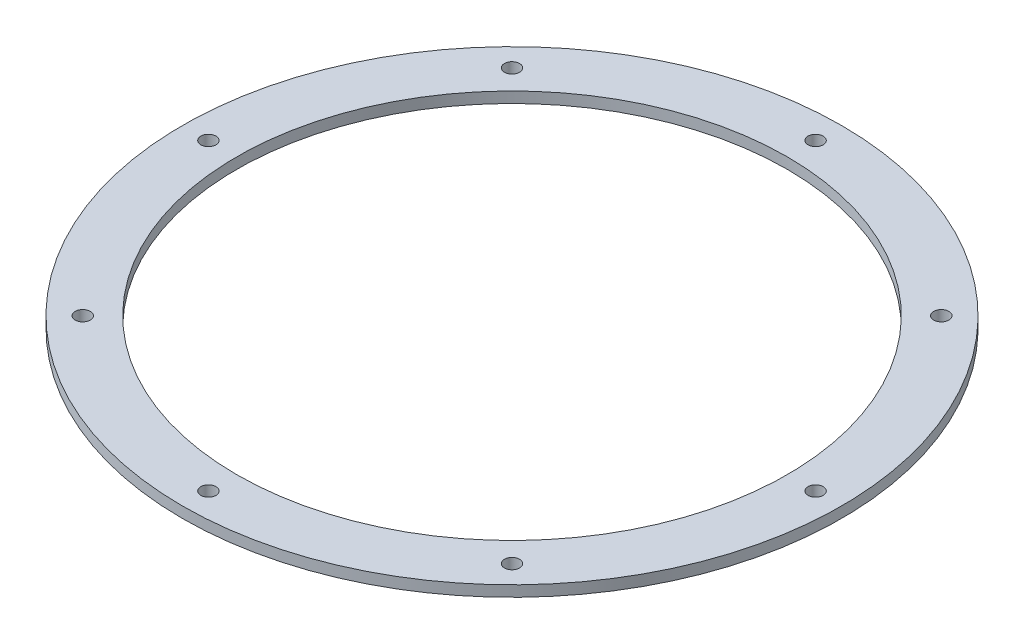
ISO-10303-21;
HEADER;
FILE_DESCRIPTION(('STEP AP214'),'2;1');
FILE_NAME('part.step','',(''),(''),'','','');
FILE_SCHEMA(('AUTOMOTIVE_DESIGN { 1 0 10303 214 1 1 1 1 }'));
ENDSEC;
DATA;
#1=APPLICATION_CONTEXT('core data for automotive mechanical design processes');
#2=APPLICATION_PROTOCOL_DEFINITION('international standard','automotive_design',2000,#1);
#3=PRODUCT_CONTEXT('',#1,'mechanical');
#4=PRODUCT('Part','Part','',(#3));
#5=PRODUCT_RELATED_PRODUCT_CATEGORY('part','',(#4));
#6=PRODUCT_DEFINITION_FORMATION('','',#4);
#7=PRODUCT_DEFINITION_CONTEXT('part definition',#1,'design');
#8=PRODUCT_DEFINITION('design','',#6,#7);
#9=PRODUCT_DEFINITION_SHAPE('','',#8);
#10=(LENGTH_UNIT() NAMED_UNIT(*) SI_UNIT(.MILLI.,.METRE.));
#11=(NAMED_UNIT(*) PLANE_ANGLE_UNIT() SI_UNIT($,.RADIAN.));
#12=(NAMED_UNIT(*) SI_UNIT($,.STERADIAN.) SOLID_ANGLE_UNIT());
#13=UNCERTAINTY_MEASURE_WITH_UNIT(LENGTH_MEASURE(1.E-05),#10,'distance_accuracy_value','');
#14=(GEOMETRIC_REPRESENTATION_CONTEXT(3) GLOBAL_UNCERTAINTY_ASSIGNED_CONTEXT((#13)) GLOBAL_UNIT_ASSIGNED_CONTEXT((#10,
#11,#12)) REPRESENTATION_CONTEXT('',''));
#15=CARTESIAN_POINT('',(0.,0.,0.));
#16=DIRECTION('',(0.,0.,1.));
#17=DIRECTION('',(1.,0.,0.));
#18=AXIS2_PLACEMENT_3D('',#15,#16,#17);
#19=CARTESIAN_POINT('',(0.,0.,0.));
#20=DIRECTION('',(0.,-1.,0.));
#21=DIRECTION('',(0.,0.,-1.));
#22=AXIS2_PLACEMENT_3D('',#19,#20,#21);
#23=CYLINDRICAL_SURFACE('',#22,76.08);
#24=CARTESIAN_POINT('',(0.,0.,0.));
#25=DIRECTION('',(0.,-1.,0.));
#26=DIRECTION('',(0.,0.,-1.));
#27=AXIS2_PLACEMENT_3D('',#24,#25,#26);
#28=CIRCLE('',#27,76.08);
#29=CARTESIAN_POINT('',(0.,0.,-76.08));
#30=VERTEX_POINT('',#29);
#31=EDGE_CURVE('E10',#30,#30,#28,.T.);
#32=ORIENTED_EDGE('',*,*,#31,.T.);
#33=EDGE_LOOP('',(#32));
#34=FACE_BOUND('',#33,.T.);
#35=CARTESIAN_POINT('',(0.,3.,0.));
#36=DIRECTION('',(0.,-1.,0.));
#37=DIRECTION('',(0.,0.,-1.));
#38=AXIS2_PLACEMENT_3D('',#35,#36,#37);
#39=CIRCLE('',#38,76.08);
#40=CARTESIAN_POINT('',(0.,3.,-76.08));
#41=VERTEX_POINT('',#40);
#42=EDGE_CURVE('E53',#41,#41,#39,.T.);
#43=ORIENTED_EDGE('',*,*,#42,.F.);
#44=EDGE_LOOP('',(#43));
#45=FACE_BOUND('',#44,.T.);
#46=ADVANCED_FACE('F39',(#34,#45),#23,.F.);
#47=CARTESIAN_POINT('',(76.08,0.,0.));
#48=DIRECTION('',(0.,-1.,0.));
#49=DIRECTION('',(0.,0.,-1.));
#50=AXIS2_PLACEMENT_3D('',#47,#48,#49);
#51=PLANE('',#50);
#52=CARTESIAN_POINT('',(-83.9,0.,0.));
#53=DIRECTION('',(0.,-1.,0.));
#54=DIRECTION('',(0.,0.,-1.));
#55=AXIS2_PLACEMENT_3D('',#52,#53,#54);
#56=CIRCLE('',#55,2.1);
#57=CARTESIAN_POINT('',(-83.9,0.,-2.1));
#58=VERTEX_POINT('',#57);
#59=EDGE_CURVE('E58',#58,#58,#56,.T.);
#60=ORIENTED_EDGE('',*,*,#59,.F.);
#61=EDGE_LOOP('',(#60));
#62=FACE_BOUND('',#61,.T.);
#63=CARTESIAN_POINT('',(-59.3262589415513,0.,-59.3262589415513));
#64=DIRECTION('',(0.,-1.,0.));
#65=DIRECTION('',(0.,0.,-1.));
#66=AXIS2_PLACEMENT_3D('',#63,#64,#65);
#67=CIRCLE('',#66,2.1);
#68=CARTESIAN_POINT('',(-59.3262589415513,0.,-61.4262589415513));
#69=VERTEX_POINT('',#68);
#70=EDGE_CURVE('E61',#69,#69,#67,.T.);
#71=ORIENTED_EDGE('',*,*,#70,.F.);
#72=EDGE_LOOP('',(#71));
#73=FACE_BOUND('',#72,.T.);
#74=CARTESIAN_POINT('',(0.,0.,-83.9));
#75=DIRECTION('',(0.,-1.,0.));
#76=DIRECTION('',(0.,0.,-1.));
#77=AXIS2_PLACEMENT_3D('',#74,#75,#76);
#78=CIRCLE('',#77,2.1);
#79=CARTESIAN_POINT('',(0.,0.,-86.));
#80=VERTEX_POINT('',#79);
#81=EDGE_CURVE('E64',#80,#80,#78,.T.);
#82=ORIENTED_EDGE('',*,*,#81,.F.);
#83=EDGE_LOOP('',(#82));
#84=FACE_BOUND('',#83,.T.);
#85=CARTESIAN_POINT('',(59.3262589415513,0.,-59.3262589415513));
#86=DIRECTION('',(0.,-1.,0.));
#87=DIRECTION('',(0.,0.,-1.));
#88=AXIS2_PLACEMENT_3D('',#85,#86,#87);
#89=CIRCLE('',#88,2.1);
#90=CARTESIAN_POINT('',(59.3262589415513,0.,-61.4262589415513));
#91=VERTEX_POINT('',#90);
#92=EDGE_CURVE('E67',#91,#91,#89,.T.);
#93=ORIENTED_EDGE('',*,*,#92,.F.);
#94=EDGE_LOOP('',(#93));
#95=FACE_BOUND('',#94,.T.);
#96=CARTESIAN_POINT('',(83.9,0.,0.));
#97=DIRECTION('',(0.,-1.,0.));
#98=DIRECTION('',(0.,0.,-1.));
#99=AXIS2_PLACEMENT_3D('',#96,#97,#98);
#100=CIRCLE('',#99,2.1);
#101=CARTESIAN_POINT('',(83.9,0.,-2.10000000000002));
#102=VERTEX_POINT('',#101);
#103=EDGE_CURVE('E70',#102,#102,#100,.T.);
#104=ORIENTED_EDGE('',*,*,#103,.F.);
#105=EDGE_LOOP('',(#104));
#106=FACE_BOUND('',#105,.T.);
#107=CARTESIAN_POINT('',(59.3262589415514,0.,59.3262589415513));
#108=DIRECTION('',(0.,-1.,0.));
#109=DIRECTION('',(0.,0.,-1.));
#110=AXIS2_PLACEMENT_3D('',#107,#108,#109);
#111=CIRCLE('',#110,2.1);
#112=CARTESIAN_POINT('',(59.3262589415514,0.,57.2262589415513));
#113=VERTEX_POINT('',#112);
#114=EDGE_CURVE('E73',#113,#113,#111,.T.);
#115=ORIENTED_EDGE('',*,*,#114,.F.);
#116=EDGE_LOOP('',(#115));
#117=FACE_BOUND('',#116,.T.);
#118=CARTESIAN_POINT('',(0.,0.,83.9));
#119=DIRECTION('',(0.,-1.,0.));
#120=DIRECTION('',(0.,0.,-1.));
#121=AXIS2_PLACEMENT_3D('',#118,#119,#120);
#122=CIRCLE('',#121,2.1);
#123=CARTESIAN_POINT('',(0.,0.,81.8));
#124=VERTEX_POINT('',#123);
#125=EDGE_CURVE('E76',#124,#124,#122,.T.);
#126=ORIENTED_EDGE('',*,*,#125,.F.);
#127=EDGE_LOOP('',(#126));
#128=FACE_BOUND('',#127,.T.);
#129=CARTESIAN_POINT('',(-59.3262589415514,0.,59.3262589415513));
#130=DIRECTION('',(0.,-1.,0.));
#131=DIRECTION('',(0.,0.,-1.));
#132=AXIS2_PLACEMENT_3D('',#129,#130,#131);
#133=CIRCLE('',#132,2.1);
#134=CARTESIAN_POINT('',(-59.3262589415514,0.,57.2262589415513));
#135=VERTEX_POINT('',#134);
#136=EDGE_CURVE('E79',#135,#135,#133,.T.);
#137=ORIENTED_EDGE('',*,*,#136,.F.);
#138=EDGE_LOOP('',(#137));
#139=FACE_BOUND('',#138,.T.);
#140=CARTESIAN_POINT('',(0.,0.,0.));
#141=DIRECTION('',(0.,-1.,0.));
#142=DIRECTION('',(0.,0.,-1.));
#143=AXIS2_PLACEMENT_3D('',#140,#141,#142);
#144=CIRCLE('',#143,91.08);
#145=CARTESIAN_POINT('',(0.,0.,-91.08));
#146=VERTEX_POINT('',#145);
#147=EDGE_CURVE('E45',#146,#146,#144,.T.);
#148=ORIENTED_EDGE('',*,*,#147,.T.);
#149=EDGE_LOOP('',(#148));
#150=FACE_BOUND('',#149,.T.);
#151=ORIENTED_EDGE('',*,*,#31,.F.);
#152=EDGE_LOOP('',(#151));
#153=FACE_BOUND('',#152,.T.);
#154=ADVANCED_FACE('F135',(#62,#73,#84,#95,#106,#117,#128,#139,#150,#153),#51,.T.);
#155=CARTESIAN_POINT('',(0.,0.,0.));
#156=DIRECTION('',(0.,-1.,0.));
#157=DIRECTION('',(0.,0.,-1.));
#158=AXIS2_PLACEMENT_3D('',#155,#156,#157);
#159=CYLINDRICAL_SURFACE('',#158,91.08);
#160=CARTESIAN_POINT('',(0.,3.,0.));
#161=DIRECTION('',(0.,-1.,0.));
#162=DIRECTION('',(0.,0.,-1.));
#163=AXIS2_PLACEMENT_3D('',#160,#161,#162);
#164=CIRCLE('',#163,91.08);
#165=CARTESIAN_POINT('',(0.,3.,-91.08));
#166=VERTEX_POINT('',#165);
#167=EDGE_CURVE('E49',#166,#166,#164,.T.);
#168=ORIENTED_EDGE('',*,*,#167,.T.);
#169=EDGE_LOOP('',(#168));
#170=FACE_BOUND('',#169,.T.);
#171=ORIENTED_EDGE('',*,*,#147,.F.);
#172=EDGE_LOOP('',(#171));
#173=FACE_BOUND('',#172,.T.);
#174=ADVANCED_FACE('F113',(#170,#173),#159,.T.);
#175=CARTESIAN_POINT('',(76.08,3.,0.));
#176=DIRECTION('',(0.,1.,0.));
#177=DIRECTION('',(0.,0.,1.));
#178=AXIS2_PLACEMENT_3D('',#175,#176,#177);
#179=PLANE('',#178);
#180=CARTESIAN_POINT('',(-83.9,3.,0.));
#181=DIRECTION('',(0.,1.,0.));
#182=DIRECTION('',(0.,0.,1.));
#183=AXIS2_PLACEMENT_3D('',#180,#181,#182);
#184=CIRCLE('',#183,2.1);
#185=CARTESIAN_POINT('',(-83.9,3.,2.1));
#186=VERTEX_POINT('',#185);
#187=EDGE_CURVE('E82',#186,#186,#184,.T.);
#188=ORIENTED_EDGE('',*,*,#187,.F.);
#189=EDGE_LOOP('',(#188));
#190=FACE_BOUND('',#189,.T.);
#191=CARTESIAN_POINT('',(-59.3262589415513,3.,-59.3262589415513));
#192=DIRECTION('',(0.,1.,0.));
#193=DIRECTION('',(0.,0.,1.));
#194=AXIS2_PLACEMENT_3D('',#191,#192,#193);
#195=CIRCLE('',#194,2.1);
#196=CARTESIAN_POINT('',(-59.3262589415513,3.,-57.2262589415513));
#197=VERTEX_POINT('',#196);
#198=EDGE_CURVE('E101',#197,#197,#195,.T.);
#199=ORIENTED_EDGE('',*,*,#198,.F.);
#200=EDGE_LOOP('',(#199));
#201=FACE_BOUND('',#200,.T.);
#202=CARTESIAN_POINT('',(0.,3.,-83.9));
#203=DIRECTION('',(0.,1.,0.));
#204=DIRECTION('',(0.,0.,1.));
#205=AXIS2_PLACEMENT_3D('',#202,#203,#204);
#206=CIRCLE('',#205,2.1);
#207=CARTESIAN_POINT('',(0.,3.,-81.8));
#208=VERTEX_POINT('',#207);
#209=EDGE_CURVE('E98',#208,#208,#206,.T.);
#210=ORIENTED_EDGE('',*,*,#209,.F.);
#211=EDGE_LOOP('',(#210));
#212=FACE_BOUND('',#211,.T.);
#213=CARTESIAN_POINT('',(59.3262589415513,3.,-59.3262589415513));
#214=DIRECTION('',(0.,1.,0.));
#215=DIRECTION('',(0.,0.,1.));
#216=AXIS2_PLACEMENT_3D('',#213,#214,#215);
#217=CIRCLE('',#216,2.1);
#218=CARTESIAN_POINT('',(59.3262589415513,3.,-57.2262589415513));
#219=VERTEX_POINT('',#218);
#220=EDGE_CURVE('E95',#219,#219,#217,.T.);
#221=ORIENTED_EDGE('',*,*,#220,.F.);
#222=EDGE_LOOP('',(#221));
#223=FACE_BOUND('',#222,.T.);
#224=CARTESIAN_POINT('',(83.9,3.,0.));
#225=DIRECTION('',(0.,1.,0.));
#226=DIRECTION('',(0.,0.,1.));
#227=AXIS2_PLACEMENT_3D('',#224,#225,#226);
#228=CIRCLE('',#227,2.1);
#229=CARTESIAN_POINT('',(83.9,3.,2.09999999999999));
#230=VERTEX_POINT('',#229);
#231=EDGE_CURVE('E92',#230,#230,#228,.T.);
#232=ORIENTED_EDGE('',*,*,#231,.F.);
#233=EDGE_LOOP('',(#232));
#234=FACE_BOUND('',#233,.T.);
#235=CARTESIAN_POINT('',(59.3262589415514,3.,59.3262589415513));
#236=DIRECTION('',(0.,1.,0.));
#237=DIRECTION('',(0.,0.,1.));
#238=AXIS2_PLACEMENT_3D('',#235,#236,#237);
#239=CIRCLE('',#238,2.1);
#240=CARTESIAN_POINT('',(59.3262589415514,3.,61.4262589415513));
#241=VERTEX_POINT('',#240);
#242=EDGE_CURVE('E89',#241,#241,#239,.T.);
#243=ORIENTED_EDGE('',*,*,#242,.F.);
#244=EDGE_LOOP('',(#243));
#245=FACE_BOUND('',#244,.T.);
#246=CARTESIAN_POINT('',(0.,3.,83.9));
#247=DIRECTION('',(0.,1.,0.));
#248=DIRECTION('',(0.,0.,1.));
#249=AXIS2_PLACEMENT_3D('',#246,#247,#248);
#250=CIRCLE('',#249,2.1);
#251=CARTESIAN_POINT('',(0.,3.,86.));
#252=VERTEX_POINT('',#251);
#253=EDGE_CURVE('E86',#252,#252,#250,.T.);
#254=ORIENTED_EDGE('',*,*,#253,.F.);
#255=EDGE_LOOP('',(#254));
#256=FACE_BOUND('',#255,.T.);
#257=CARTESIAN_POINT('',(-59.3262589415514,3.,59.3262589415513));
#258=DIRECTION('',(0.,1.,0.));
#259=DIRECTION('',(0.,0.,1.));
#260=AXIS2_PLACEMENT_3D('',#257,#258,#259);
#261=CIRCLE('',#260,2.1);
#262=CARTESIAN_POINT('',(-59.3262589415514,3.,61.4262589415513));
#263=VERTEX_POINT('',#262);
#264=EDGE_CURVE('E83',#263,#263,#261,.T.);
#265=ORIENTED_EDGE('',*,*,#264,.F.);
#266=EDGE_LOOP('',(#265));
#267=FACE_BOUND('',#266,.T.);
#268=ORIENTED_EDGE('',*,*,#42,.T.);
#269=EDGE_LOOP('',(#268));
#270=FACE_BOUND('',#269,.T.);
#271=ORIENTED_EDGE('',*,*,#167,.F.);
#272=EDGE_LOOP('',(#271));
#273=FACE_BOUND('',#272,.T.);
#274=ADVANCED_FACE('F109',(#190,#201,#212,#223,#234,#245,#256,#267,#270,#273),#179,.T.);
#275=CARTESIAN_POINT('',(-59.3262589415514,-7.,59.3262589415513));
#276=DIRECTION('',(0.,1.,0.));
#277=DIRECTION('',(0.,0.,1.));
#278=AXIS2_PLACEMENT_3D('',#275,#276,#277);
#279=CYLINDRICAL_SURFACE('',#278,2.1);
#280=ORIENTED_EDGE('',*,*,#136,.T.);
#281=EDGE_LOOP('',(#280));
#282=FACE_BOUND('',#281,.T.);
#283=ORIENTED_EDGE('',*,*,#264,.T.);
#284=EDGE_LOOP('',(#283));
#285=FACE_BOUND('',#284,.T.);
#286=ADVANCED_FACE('F112',(#282,#285),#279,.F.);
#287=CARTESIAN_POINT('',(0.,-7.,83.9));
#288=DIRECTION('',(0.,1.,0.));
#289=DIRECTION('',(0.,0.,1.));
#290=AXIS2_PLACEMENT_3D('',#287,#288,#289);
#291=CYLINDRICAL_SURFACE('',#290,2.1);
#292=ORIENTED_EDGE('',*,*,#125,.T.);
#293=EDGE_LOOP('',(#292));
#294=FACE_BOUND('',#293,.T.);
#295=ORIENTED_EDGE('',*,*,#253,.T.);
#296=EDGE_LOOP('',(#295));
#297=FACE_BOUND('',#296,.T.);
#298=ADVANCED_FACE('F171',(#294,#297),#291,.F.);
#299=CARTESIAN_POINT('',(59.3262589415514,-7.,59.3262589415513));
#300=DIRECTION('',(0.,1.,0.));
#301=DIRECTION('',(0.,0.,1.));
#302=AXIS2_PLACEMENT_3D('',#299,#300,#301);
#303=CYLINDRICAL_SURFACE('',#302,2.1);
#304=ORIENTED_EDGE('',*,*,#114,.T.);
#305=EDGE_LOOP('',(#304));
#306=FACE_BOUND('',#305,.T.);
#307=ORIENTED_EDGE('',*,*,#242,.T.);
#308=EDGE_LOOP('',(#307));
#309=FACE_BOUND('',#308,.T.);
#310=ADVANCED_FACE('F181',(#306,#309),#303,.F.);
#311=CARTESIAN_POINT('',(83.9,-7.,0.));
#312=DIRECTION('',(0.,1.,0.));
#313=DIRECTION('',(0.,0.,1.));
#314=AXIS2_PLACEMENT_3D('',#311,#312,#313);
#315=CYLINDRICAL_SURFACE('',#314,2.1);
#316=ORIENTED_EDGE('',*,*,#103,.T.);
#317=EDGE_LOOP('',(#316));
#318=FACE_BOUND('',#317,.T.);
#319=ORIENTED_EDGE('',*,*,#231,.T.);
#320=EDGE_LOOP('',(#319));
#321=FACE_BOUND('',#320,.T.);
#322=ADVANCED_FACE('F191',(#318,#321),#315,.F.);
#323=CARTESIAN_POINT('',(59.3262589415513,-7.,-59.3262589415513));
#324=DIRECTION('',(0.,1.,0.));
#325=DIRECTION('',(0.,0.,1.));
#326=AXIS2_PLACEMENT_3D('',#323,#324,#325);
#327=CYLINDRICAL_SURFACE('',#326,2.1);
#328=ORIENTED_EDGE('',*,*,#92,.T.);
#329=EDGE_LOOP('',(#328));
#330=FACE_BOUND('',#329,.T.);
#331=ORIENTED_EDGE('',*,*,#220,.T.);
#332=EDGE_LOOP('',(#331));
#333=FACE_BOUND('',#332,.T.);
#334=ADVANCED_FACE('F201',(#330,#333),#327,.F.);
#335=CARTESIAN_POINT('',(0.,-7.,-83.9));
#336=DIRECTION('',(0.,1.,0.));
#337=DIRECTION('',(0.,0.,1.));
#338=AXIS2_PLACEMENT_3D('',#335,#336,#337);
#339=CYLINDRICAL_SURFACE('',#338,2.1);
#340=ORIENTED_EDGE('',*,*,#81,.T.);
#341=EDGE_LOOP('',(#340));
#342=FACE_BOUND('',#341,.T.);
#343=ORIENTED_EDGE('',*,*,#209,.T.);
#344=EDGE_LOOP('',(#343));
#345=FACE_BOUND('',#344,.T.);
#346=ADVANCED_FACE('F211',(#342,#345),#339,.F.);
#347=CARTESIAN_POINT('',(-59.3262589415513,-7.,-59.3262589415513));
#348=DIRECTION('',(0.,1.,0.));
#349=DIRECTION('',(0.,0.,1.));
#350=AXIS2_PLACEMENT_3D('',#347,#348,#349);
#351=CYLINDRICAL_SURFACE('',#350,2.1);
#352=ORIENTED_EDGE('',*,*,#70,.T.);
#353=EDGE_LOOP('',(#352));
#354=FACE_BOUND('',#353,.T.);
#355=ORIENTED_EDGE('',*,*,#198,.T.);
#356=EDGE_LOOP('',(#355));
#357=FACE_BOUND('',#356,.T.);
#358=ADVANCED_FACE('F221',(#354,#357),#351,.F.);
#359=CARTESIAN_POINT('',(-83.9,-7.,0.));
#360=DIRECTION('',(0.,1.,0.));
#361=DIRECTION('',(0.,0.,1.));
#362=AXIS2_PLACEMENT_3D('',#359,#360,#361);
#363=CYLINDRICAL_SURFACE('',#362,2.1);
#364=ORIENTED_EDGE('',*,*,#59,.T.);
#365=EDGE_LOOP('',(#364));
#366=FACE_BOUND('',#365,.T.);
#367=ORIENTED_EDGE('',*,*,#187,.T.);
#368=EDGE_LOOP('',(#367));
#369=FACE_BOUND('',#368,.T.);
#370=ADVANCED_FACE('F107',(#366,#369),#363,.F.);
#371=CLOSED_SHELL('',(#46,#154,#174,#274,#286,#298,#310,#322,#334,#346,#358,#370));
#372=MANIFOLD_SOLID_BREP('B2',#371);
#373=ADVANCED_BREP_SHAPE_REPRESENTATION('',(#18,#372),#14);
#374=SHAPE_DEFINITION_REPRESENTATION(#9,#373);
ENDSEC;
END-ISO-10303-21;
